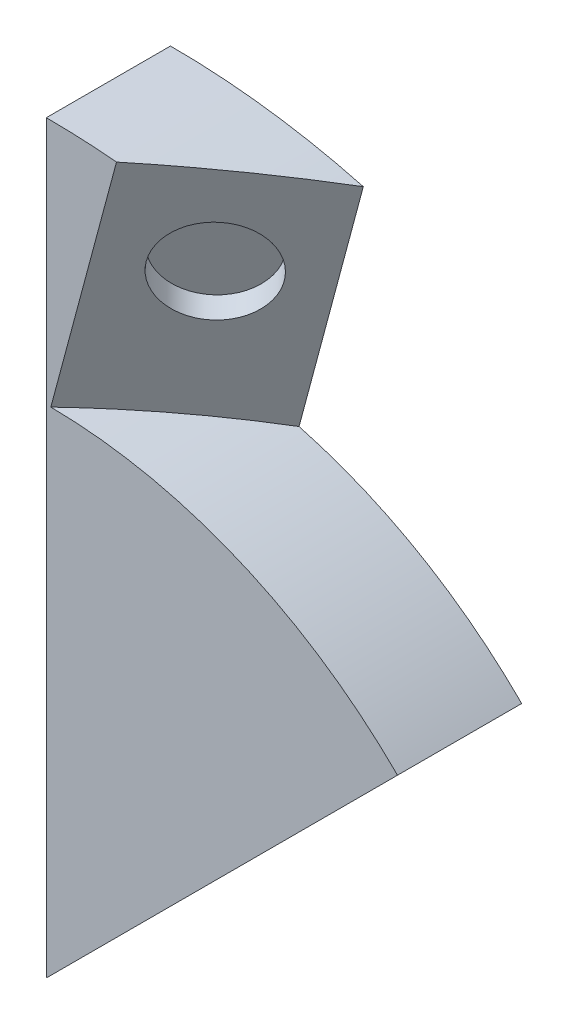
ISO-10303-21;
HEADER;
FILE_DESCRIPTION(('STEP AP214'),'2;1');
FILE_NAME('part.step','',(''),(''),'','','');
FILE_SCHEMA(('AUTOMOTIVE_DESIGN { 1 0 10303 214 1 1 1 1 }'));
ENDSEC;
DATA;
#1=APPLICATION_CONTEXT('core data for automotive mechanical design processes');
#2=APPLICATION_PROTOCOL_DEFINITION('international standard','automotive_design',2000,#1);
#3=PRODUCT_CONTEXT('',#1,'mechanical');
#4=PRODUCT('Part','Part','',(#3));
#5=PRODUCT_RELATED_PRODUCT_CATEGORY('part','',(#4));
#6=PRODUCT_DEFINITION_FORMATION('','',#4);
#7=PRODUCT_DEFINITION_CONTEXT('part definition',#1,'design');
#8=PRODUCT_DEFINITION('design','',#6,#7);
#9=PRODUCT_DEFINITION_SHAPE('','',#8);
#10=(LENGTH_UNIT() NAMED_UNIT(*) SI_UNIT(.MILLI.,.METRE.));
#11=(NAMED_UNIT(*) PLANE_ANGLE_UNIT() SI_UNIT($,.RADIAN.));
#12=(NAMED_UNIT(*) SI_UNIT($,.STERADIAN.) SOLID_ANGLE_UNIT());
#13=UNCERTAINTY_MEASURE_WITH_UNIT(LENGTH_MEASURE(1.E-05),#10,'distance_accuracy_value','');
#14=(GEOMETRIC_REPRESENTATION_CONTEXT(3) GLOBAL_UNCERTAINTY_ASSIGNED_CONTEXT((#13)) GLOBAL_UNIT_ASSIGNED_CONTEXT((#10,
#11,#12)) REPRESENTATION_CONTEXT('',''));
#15=CARTESIAN_POINT('',(0.,0.,0.));
#16=DIRECTION('',(0.,0.,1.));
#17=DIRECTION('',(1.,0.,0.));
#18=AXIS2_PLACEMENT_3D('',#15,#16,#17);
#19=CARTESIAN_POINT('',(0.,0.,5.));
#20=DIRECTION('',(-0.707106781186546,0.707106781186549,0.));
#21=DIRECTION('',(-0.707106781186549,-0.707106781186546,0.));
#22=AXIS2_PLACEMENT_3D('',#19,#20,#21);
#23=PLANE('',#22);
#24=DIRECTION('',(0.707106781186549,0.707106781186546,0.));
#25=VECTOR('',#24,1.);
#26=CARTESIAN_POINT('',(0.,0.,0.));
#27=LINE('',#26,#25);
#28=CARTESIAN_POINT('',(0.,0.,0.));
#29=VERTEX_POINT('',#28);
#30=CARTESIAN_POINT('',(14.142135623731,14.1421356237309,0.));
#31=VERTEX_POINT('',#30);
#32=EDGE_CURVE('E97',#29,#31,#27,.T.);
#33=ORIENTED_EDGE('',*,*,#32,.T.);
#34=DIRECTION('',(0.,0.,1.));
#35=VECTOR('',#34,1.);
#36=CARTESIAN_POINT('',(14.142135623731,14.1421356237309,0.));
#37=LINE('',#36,#35);
#38=CARTESIAN_POINT('',(14.142135623731,14.1421356237309,5.));
#39=VERTEX_POINT('',#38);
#40=EDGE_CURVE('E88',#31,#39,#37,.T.);
#41=ORIENTED_EDGE('',*,*,#40,.T.);
#42=DIRECTION('',(0.707106781186549,0.707106781186546,0.));
#43=VECTOR('',#42,1.);
#44=CARTESIAN_POINT('',(0.,0.,5.));
#45=LINE('',#44,#43);
#46=CARTESIAN_POINT('',(0.,0.,5.));
#47=VERTEX_POINT('',#46);
#48=EDGE_CURVE('E123',#47,#39,#45,.T.);
#49=ORIENTED_EDGE('',*,*,#48,.F.);
#50=DIRECTION('',(0.,0.,-1.));
#51=VECTOR('',#50,1.);
#52=CARTESIAN_POINT('',(0.,0.,5.));
#53=LINE('',#52,#51);
#54=EDGE_CURVE('E110',#47,#29,#53,.T.);
#55=ORIENTED_EDGE('',*,*,#54,.T.);
#56=EDGE_LOOP('',(#33,#41,#49,#55));
#57=FACE_BOUND('',#56,.T.);
#58=ADVANCED_FACE('F41',(#57),#23,.F.);
#59=CARTESIAN_POINT('',(0.,0.,5.));
#60=DIRECTION('',(0.,0.,-1.));
#61=DIRECTION('',(-1.,0.,0.));
#62=AXIS2_PLACEMENT_3D('',#59,#60,#61);
#63=CYLINDRICAL_SURFACE('',#62,30.);
#64=CARTESIAN_POINT('',(0.,0.,5.));
#65=DIRECTION('',(0.,0.,1.));
#66=DIRECTION('',(1.,0.,0.));
#67=AXIS2_PLACEMENT_3D('',#64,#65,#66);
#68=CIRCLE('',#67,30.);
#69=CARTESIAN_POINT('',(2.8263414696153,29.8665664899254,5.));
#70=VERTEX_POINT('',#69);
#71=CARTESIAN_POINT('',(0.,30.,5.));
#72=VERTEX_POINT('',#71);
#73=EDGE_CURVE('E136',#70,#72,#68,.T.);
#74=ORIENTED_EDGE('',*,*,#73,.F.);
#75=CARTESIAN_POINT('',(0.,0.,0.));
#76=DIRECTION('',(0.68301270189222,-0.183012701892215,0.707106781186549));
#77=DIRECTION('',(0.683012701892222,-0.183012701892215,-0.707106781186546));
#78=AXIS2_PLACEMENT_3D('',#75,#76,#77);
#79=ELLIPSE('',#78,42.4264068711928,30.);
#80=CARTESIAN_POINT('',(7.76457135307543,28.9777747886721,0.));
#81=VERTEX_POINT('',#80);
#82=EDGE_CURVE('E51',#70,#81,#79,.F.);
#83=ORIENTED_EDGE('',*,*,#82,.T.);
#84=CARTESIAN_POINT('',(0.,0.,0.));
#85=DIRECTION('',(0.,0.,1.));
#86=DIRECTION('',(1.,0.,0.));
#87=AXIS2_PLACEMENT_3D('',#84,#85,#86);
#88=CIRCLE('',#87,30.);
#89=CARTESIAN_POINT('',(0.,30.,0.));
#90=VERTEX_POINT('',#89);
#91=EDGE_CURVE('E112',#81,#90,#88,.T.);
#92=ORIENTED_EDGE('',*,*,#91,.T.);
#93=DIRECTION('',(0.,0.,-1.));
#94=VECTOR('',#93,1.);
#95=CARTESIAN_POINT('',(0.,30.,5.));
#96=LINE('',#95,#94);
#97=EDGE_CURVE('E126',#72,#90,#96,.T.);
#98=ORIENTED_EDGE('',*,*,#97,.F.);
#99=EDGE_LOOP('',(#74,#83,#92,#98));
#100=FACE_BOUND('',#99,.T.);
#101=ADVANCED_FACE('F134',(#100),#63,.T.);
#102=CARTESIAN_POINT('',(0.,0.,5.));
#103=DIRECTION('',(1.,0.,0.));
#104=DIRECTION('',(0.,0.,-1.));
#105=AXIS2_PLACEMENT_3D('',#102,#103,#104);
#106=PLANE('',#105);
#107=DIRECTION('',(0.,-1.,0.));
#108=VECTOR('',#107,1.);
#109=CARTESIAN_POINT('',(0.,0.,0.));
#110=LINE('',#109,#108);
#111=EDGE_CURVE('E115',#90,#29,#110,.T.);
#112=ORIENTED_EDGE('',*,*,#111,.T.);
#113=ORIENTED_EDGE('',*,*,#54,.F.);
#114=DIRECTION('',(0.,-1.,0.));
#115=VECTOR('',#114,1.);
#116=CARTESIAN_POINT('',(0.,0.,5.));
#117=LINE('',#116,#115);
#118=EDGE_CURVE('E118',#72,#47,#117,.T.);
#119=ORIENTED_EDGE('',*,*,#118,.F.);
#120=ORIENTED_EDGE('',*,*,#97,.T.);
#121=EDGE_LOOP('',(#112,#113,#119,#120));
#122=FACE_BOUND('',#121,.T.);
#123=ADVANCED_FACE('F151',(#122),#106,.F.);
#124=CARTESIAN_POINT('',(0.,0.,5.));
#125=DIRECTION('',(0.,0.,1.));
#126=DIRECTION('',(1.,0.,0.));
#127=AXIS2_PLACEMENT_3D('',#124,#125,#126);
#128=PLANE('',#127);
#129=CARTESIAN_POINT('',(0.,0.,5.));
#130=DIRECTION('',(0.,0.,-1.));
#131=DIRECTION('',(1.,0.,0.));
#132=AXIS2_PLACEMENT_3D('',#129,#130,#131);
#133=CIRCLE('',#132,20.0000000000001);
#134=CARTESIAN_POINT('',(0.182380125371365,19.9991684199586,5.));
#135=VERTEX_POINT('',#134);
#136=EDGE_CURVE('E58',#135,#39,#133,.T.);
#137=ORIENTED_EDGE('',*,*,#136,.F.);
#138=DIRECTION('',(0.258819045102514,0.96592582628907,0.));
#139=VECTOR('',#138,1.);
#140=CARTESIAN_POINT('',(2.93494222163006,30.2718700141847,5.));
#141=LINE('',#140,#139);
#142=EDGE_CURVE('E62',#135,#70,#141,.T.);
#143=ORIENTED_EDGE('',*,*,#142,.T.);
#144=ORIENTED_EDGE('',*,*,#73,.T.);
#145=ORIENTED_EDGE('',*,*,#118,.T.);
#146=ORIENTED_EDGE('',*,*,#48,.T.);
#147=EDGE_LOOP('',(#137,#143,#144,#145,#146));
#148=FACE_BOUND('',#147,.T.);
#149=ADVANCED_FACE('F149',(#148),#128,.T.);
#150=CARTESIAN_POINT('',(0.,0.,0.));
#151=DIRECTION('',(0.,0.,1.));
#152=DIRECTION('',(1.,0.,0.));
#153=AXIS2_PLACEMENT_3D('',#150,#151,#152);
#154=PLANE('',#153);
#155=DIRECTION('',(-0.258819045102514,-0.96592582628907,0.));
#156=VECTOR('',#155,1.);
#157=CARTESIAN_POINT('',(5.17638090205029,19.3185165257814,0.));
#158=LINE('',#157,#156);
#159=CARTESIAN_POINT('',(5.17638090205029,19.3185165257814,0.));
#160=VERTEX_POINT('',#159);
#161=EDGE_CURVE('E98',#81,#160,#158,.T.);
#162=ORIENTED_EDGE('',*,*,#161,.T.);
#163=CARTESIAN_POINT('',(0.,0.,0.));
#164=DIRECTION('',(0.,0.,-1.));
#165=DIRECTION('',(1.,0.,0.));
#166=AXIS2_PLACEMENT_3D('',#163,#164,#165);
#167=CIRCLE('',#166,20.0000000000001);
#168=EDGE_CURVE('E91',#160,#31,#167,.T.);
#169=ORIENTED_EDGE('',*,*,#168,.T.);
#170=ORIENTED_EDGE('',*,*,#32,.F.);
#171=ORIENTED_EDGE('',*,*,#111,.F.);
#172=ORIENTED_EDGE('',*,*,#91,.F.);
#173=EDGE_LOOP('',(#162,#169,#170,#171,#172));
#174=FACE_BOUND('',#173,.T.);
#175=ADVANCED_FACE('F102',(#174),#154,.F.);
#176=CARTESIAN_POINT('',(0.,0.,0.));
#177=DIRECTION('',(0.,0.,1.));
#178=DIRECTION('',(1.,0.,0.));
#179=AXIS2_PLACEMENT_3D('',#176,#177,#178);
#180=CYLINDRICAL_SURFACE('',#179,20.0000000000001);
#181=ORIENTED_EDGE('',*,*,#136,.T.);
#182=ORIENTED_EDGE('',*,*,#40,.F.);
#183=ORIENTED_EDGE('',*,*,#168,.F.);
#184=CARTESIAN_POINT('',(0.,0.,0.));
#185=DIRECTION('',(0.68301270189222,-0.183012701892215,0.707106781186549));
#186=DIRECTION('',(-0.683012701892222,0.183012701892215,0.707106781186546));
#187=AXIS2_PLACEMENT_3D('',#184,#185,#186);
#188=ELLIPSE('',#187,28.284271247462,20.0000000000001);
#189=EDGE_CURVE('E11',#160,#135,#188,.T.);
#190=ORIENTED_EDGE('',*,*,#189,.T.);
#191=EDGE_LOOP('',(#181,#182,#183,#190));
#192=FACE_BOUND('',#191,.T.);
#193=ADVANCED_FACE('F90',(#192),#180,.T.);
#194=CARTESIAN_POINT('',(5.17638090205029,19.3185165257814,0.));
#195=DIRECTION('',(0.68301270189222,-0.183012701892215,0.707106781186549));
#196=DIRECTION('',(0.258819045102514,0.96592582628907,0.));
#197=AXIS2_PLACEMENT_3D('',#194,#195,#196);
#198=PLANE('',#197);
#199=CARTESIAN_POINT('',(4.27750016823069,25.5260257837131,2.47487373415292));
#200=DIRECTION('',(0.68301270189222,-0.183012701892214,0.707106781186549));
#201=DIRECTION('',(0.719254596676404,0.,-0.694746590606865));
#202=AXIS2_PLACEMENT_3D('',#199,#200,#201);
#203=CIRCLE('',#202,1.99999999999999);
#204=CARTESIAN_POINT('',(5.71600936158349,25.5260257837131,1.08538055293919));
#205=VERTEX_POINT('',#204);
#206=EDGE_CURVE('E225',#205,#205,#203,.T.);
#207=ORIENTED_EDGE('',*,*,#206,.F.);
#208=EDGE_LOOP('',(#207));
#209=FACE_BOUND('',#208,.T.);
#210=ORIENTED_EDGE('',*,*,#82,.F.);
#211=ORIENTED_EDGE('',*,*,#142,.F.);
#212=ORIENTED_EDGE('',*,*,#189,.F.);
#213=ORIENTED_EDGE('',*,*,#161,.F.);
#214=EDGE_LOOP('',(#210,#211,#212,#213));
#215=FACE_BOUND('',#214,.T.);
#216=ADVANCED_FACE('F44',(#209,#215),#198,.T.);
#217=CARTESIAN_POINT('',(3.59448746633847,25.7090384856053,1.76776695296637));
#218=DIRECTION('',(0.68301270189222,-0.183012701892214,0.707106781186549));
#219=DIRECTION('',(0.719254596676404,0.,-0.694746590606865));
#220=AXIS2_PLACEMENT_3D('',#217,#218,#219);
#221=CYLINDRICAL_SURFACE('',#220,1.99999999999999);
#222=CARTESIAN_POINT('',(3.59448746633847,25.7090384856053,1.76776695296637));
#223=DIRECTION('',(0.68301270189222,-0.183012701892214,0.707106781186549));
#224=DIRECTION('',(0.719254596676404,0.,-0.694746590606865));
#225=AXIS2_PLACEMENT_3D('',#222,#223,#224);
#226=CIRCLE('',#225,1.99999999999999);
#227=CARTESIAN_POINT('',(5.03299665969127,25.7090384856053,0.37827377175264));
#228=VERTEX_POINT('',#227);
#229=EDGE_CURVE('E143',#228,#228,#226,.T.);
#230=ORIENTED_EDGE('',*,*,#229,.F.);
#231=EDGE_LOOP('',(#230));
#232=FACE_BOUND('',#231,.T.);
#233=ORIENTED_EDGE('',*,*,#206,.T.);
#234=EDGE_LOOP('',(#233));
#235=FACE_BOUND('',#234,.T.);
#236=ADVANCED_FACE('F199',(#232,#235),#221,.F.);
#237=CARTESIAN_POINT('',(3.59448746633847,25.7090384856053,1.76776695296637));
#238=DIRECTION('',(0.68301270189222,-0.183012701892214,0.707106781186549));
#239=DIRECTION('',(0.719254596676404,0.,-0.694746590606865));
#240=AXIS2_PLACEMENT_3D('',#237,#238,#239);
#241=PLANE('',#240);
#242=ORIENTED_EDGE('',*,*,#229,.T.);
#243=EDGE_LOOP('',(#242));
#244=FACE_BOUND('',#243,.T.);
#245=ADVANCED_FACE('F208',(#244),#241,.T.);
#246=CLOSED_SHELL('',(#58,#101,#123,#149,#175,#193,#216,#236,#245));
#247=MANIFOLD_SOLID_BREP('B2',#246);
#248=ADVANCED_BREP_SHAPE_REPRESENTATION('',(#18,#247),#14);
#249=SHAPE_DEFINITION_REPRESENTATION(#9,#248);
ENDSEC;
END-ISO-10303-21;
